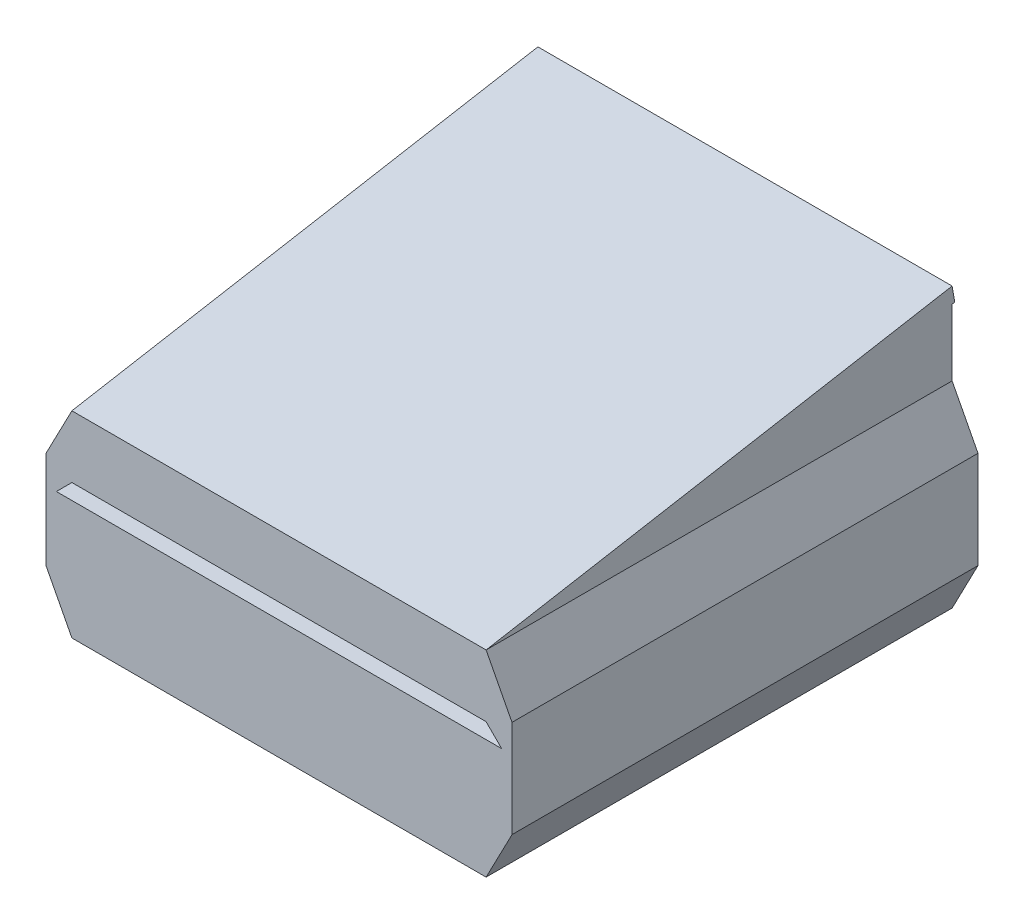
ISO-10303-21;
HEADER;
FILE_DESCRIPTION(('STEP AP214'),'2;1');
FILE_NAME('part.step','',(''),(''),'','','');
FILE_SCHEMA(('AUTOMOTIVE_DESIGN { 1 0 10303 214 1 1 1 1 }'));
ENDSEC;
DATA;
#1=APPLICATION_CONTEXT('core data for automotive mechanical design processes');
#2=APPLICATION_PROTOCOL_DEFINITION('international standard','automotive_design',2000,#1);
#3=PRODUCT_CONTEXT('',#1,'mechanical');
#4=PRODUCT('Part','Part','',(#3));
#5=PRODUCT_RELATED_PRODUCT_CATEGORY('part','',(#4));
#6=PRODUCT_DEFINITION_FORMATION('','',#4);
#7=PRODUCT_DEFINITION_CONTEXT('part definition',#1,'design');
#8=PRODUCT_DEFINITION('design','',#6,#7);
#9=PRODUCT_DEFINITION_SHAPE('','',#8);
#10=(LENGTH_UNIT() NAMED_UNIT(*) SI_UNIT(.MILLI.,.METRE.));
#11=(NAMED_UNIT(*) PLANE_ANGLE_UNIT() SI_UNIT($,.RADIAN.));
#12=(NAMED_UNIT(*) SI_UNIT($,.STERADIAN.) SOLID_ANGLE_UNIT());
#13=UNCERTAINTY_MEASURE_WITH_UNIT(LENGTH_MEASURE(1.E-05),#10,'distance_accuracy_value','');
#14=(GEOMETRIC_REPRESENTATION_CONTEXT(3) GLOBAL_UNCERTAINTY_ASSIGNED_CONTEXT((#13)) GLOBAL_UNIT_ASSIGNED_CONTEXT((#10,
#11,#12)) REPRESENTATION_CONTEXT('',''));
#15=CARTESIAN_POINT('',(0.,0.,0.));
#16=DIRECTION('',(0.,0.,1.));
#17=DIRECTION('',(1.,0.,0.));
#18=AXIS2_PLACEMENT_3D('',#15,#16,#17);
#19=CARTESIAN_POINT('',(80.,38.,-3.00000000000003));
#20=DIRECTION('',(0.,0.,1.));
#21=DIRECTION('',(1.,0.,0.));
#22=AXIS2_PLACEMENT_3D('',#19,#20,#21);
#23=PLANE('',#22);
#24=DIRECTION('',(-1.,0.,0.));
#25=VECTOR('',#24,1.);
#26=CARTESIAN_POINT('',(80.,35.482701106467,-3.00000000000003));
#27=LINE('',#26,#25);
#28=CARTESIAN_POINT('',(77.,35.482701106467,-3.00000000000006));
#29=VERTEX_POINT('',#28);
#30=CARTESIAN_POINT('',(3.,35.482701106467,-3.00000000000006));
#31=VERTEX_POINT('',#30);
#32=EDGE_CURVE('E228',#29,#31,#27,.T.);
#33=ORIENTED_EDGE('',*,*,#32,.F.);
#34=DIRECTION('',(0.,-1.,0.));
#35=VECTOR('',#34,1.);
#36=CARTESIAN_POINT('',(77.,38.,-3.00000000000006));
#37=LINE('',#36,#35);
#38=CARTESIAN_POINT('',(77.,29.,-3.00000000000006));
#39=VERTEX_POINT('',#38);
#40=EDGE_CURVE('E235',#29,#39,#37,.T.);
#41=ORIENTED_EDGE('',*,*,#40,.T.);
#42=DIRECTION('',(0.707106781186549,-0.707106781186546,0.));
#43=VECTOR('',#42,1.);
#44=CARTESIAN_POINT('',(74.,32.,-3.00000000000003));
#45=LINE('',#44,#43);
#46=CARTESIAN_POINT('',(80.,26.,-3.00000000000006));
#47=VERTEX_POINT('',#46);
#48=EDGE_CURVE('E380',#39,#47,#45,.T.);
#49=ORIENTED_EDGE('',*,*,#48,.T.);
#50=DIRECTION('',(-1.,0.,0.));
#51=VECTOR('',#50,1.);
#52=CARTESIAN_POINT('',(80.,26.,-3.00000000000003));
#53=LINE('',#52,#51);
#54=CARTESIAN_POINT('',(0.,26.,-3.00000000000006));
#55=VERTEX_POINT('',#54);
#56=EDGE_CURVE('E243',#47,#55,#53,.T.);
#57=ORIENTED_EDGE('',*,*,#56,.T.);
#58=DIRECTION('',(0.707106781186549,0.707106781186546,0.));
#59=VECTOR('',#58,1.);
#60=CARTESIAN_POINT('',(46.0000000000002,72.,-3.00000000000003));
#61=LINE('',#60,#59);
#62=CARTESIAN_POINT('',(3.,29.,-3.00000000000006));
#63=VERTEX_POINT('',#62);
#64=EDGE_CURVE('E377',#55,#63,#61,.T.);
#65=ORIENTED_EDGE('',*,*,#64,.T.);
#66=DIRECTION('',(0.,-1.,0.));
#67=VECTOR('',#66,1.);
#68=CARTESIAN_POINT('',(3.,38.,-3.00000000000006));
#69=LINE('',#68,#67);
#70=EDGE_CURVE('E241',#31,#63,#69,.T.);
#71=ORIENTED_EDGE('',*,*,#70,.F.);
#72=EDGE_LOOP('',(#33,#41,#49,#57,#65,#71));
#73=FACE_BOUND('',#72,.T.);
#74=ADVANCED_FACE('F33',(#73),#23,.F.);
#75=CARTESIAN_POINT('',(0.,3.,-90.));
#76=DIRECTION('',(0.,0.,1.));
#77=DIRECTION('',(1.,0.,0.));
#78=AXIS2_PLACEMENT_3D('',#75,#76,#77);
#79=PLANE('',#78);
#80=DIRECTION('',(-1.,0.,0.));
#81=VECTOR('',#80,1.);
#82=CARTESIAN_POINT('',(0.,50.8231484281031,-90.));
#83=LINE('',#82,#81);
#84=CARTESIAN_POINT('',(80.,50.8231484281031,-90.));
#85=VERTEX_POINT('',#84);
#86=CARTESIAN_POINT('',(77.,50.8231484281031,-90.));
#87=VERTEX_POINT('',#86);
#88=EDGE_CURVE('E226',#85,#87,#83,.T.);
#89=ORIENTED_EDGE('',*,*,#88,.F.);
#90=DIRECTION('',(0.,-1.,0.));
#91=VECTOR('',#90,1.);
#92=CARTESIAN_POINT('',(80.,68.,-90.));
#93=LINE('',#92,#91);
#94=CARTESIAN_POINT('',(80.,38.,-90.));
#95=VERTEX_POINT('',#94);
#96=EDGE_CURVE('E202',#85,#95,#93,.T.);
#97=ORIENTED_EDGE('',*,*,#96,.T.);
#98=DIRECTION('',(-0.461591586339288,0.887092558542106,0.));
#99=VECTOR('',#98,1.);
#100=CARTESIAN_POINT('',(85.,28.3909366548759,-90.));
#101=LINE('',#100,#99);
#102=CARTESIAN_POINT('',(85.,28.3909366548759,-90.));
#103=VERTEX_POINT('',#102);
#104=EDGE_CURVE('E303',#103,#95,#101,.T.);
#105=ORIENTED_EDGE('',*,*,#104,.F.);
#106=DIRECTION('',(0.,1.,0.));
#107=VECTOR('',#106,1.);
#108=CARTESIAN_POINT('',(85.,9.60906334512409,-90.));
#109=LINE('',#108,#107);
#110=CARTESIAN_POINT('',(85.,9.60906334512409,-90.));
#111=VERTEX_POINT('',#110);
#112=EDGE_CURVE('E299',#111,#103,#109,.T.);
#113=ORIENTED_EDGE('',*,*,#112,.F.);
#114=DIRECTION('',(0.461591586339288,0.887092558542106,0.));
#115=VECTOR('',#114,1.);
#116=CARTESIAN_POINT('',(80.,0.,-90.));
#117=LINE('',#116,#115);
#118=CARTESIAN_POINT('',(80.,0.,-90.));
#119=VERTEX_POINT('',#118);
#120=EDGE_CURVE('E296',#119,#111,#117,.T.);
#121=ORIENTED_EDGE('',*,*,#120,.F.);
#122=DIRECTION('',(-1.,0.,0.));
#123=VECTOR('',#122,1.);
#124=CARTESIAN_POINT('',(0.,0.,-90.));
#125=LINE('',#124,#123);
#126=CARTESIAN_POINT('',(0.,0.,-90.));
#127=VERTEX_POINT('',#126);
#128=EDGE_CURVE('E353',#119,#127,#125,.T.);
#129=ORIENTED_EDGE('',*,*,#128,.T.);
#130=DIRECTION('',(0.461591586339287,-0.887092558542106,0.));
#131=VECTOR('',#130,1.);
#132=CARTESIAN_POINT('',(0.,0.,-90.));
#133=LINE('',#132,#131);
#134=CARTESIAN_POINT('',(-5.,9.60906334512409,-90.));
#135=VERTEX_POINT('',#134);
#136=EDGE_CURVE('E323',#135,#127,#133,.T.);
#137=ORIENTED_EDGE('',*,*,#136,.F.);
#138=DIRECTION('',(0.,-1.,0.));
#139=VECTOR('',#138,1.);
#140=CARTESIAN_POINT('',(-5.,9.60906334512409,-90.));
#141=LINE('',#140,#139);
#142=CARTESIAN_POINT('',(-5.,28.3909366548759,-90.));
#143=VERTEX_POINT('',#142);
#144=EDGE_CURVE('E332',#143,#135,#141,.T.);
#145=ORIENTED_EDGE('',*,*,#144,.F.);
#146=DIRECTION('',(-0.461591586339287,-0.887092558542106,0.));
#147=VECTOR('',#146,1.);
#148=CARTESIAN_POINT('',(-5.,28.3909366548759,-90.));
#149=LINE('',#148,#147);
#150=CARTESIAN_POINT('',(0.,38.,-90.));
#151=VERTEX_POINT('',#150);
#152=EDGE_CURVE('E329',#151,#143,#149,.T.);
#153=ORIENTED_EDGE('',*,*,#152,.F.);
#154=DIRECTION('',(0.,-1.,0.));
#155=VECTOR('',#154,1.);
#156=CARTESIAN_POINT('',(0.,68.,-90.));
#157=LINE('',#156,#155);
#158=CARTESIAN_POINT('',(0.,50.8231484281031,-90.));
#159=VERTEX_POINT('',#158);
#160=EDGE_CURVE('E233',#159,#151,#157,.T.);
#161=ORIENTED_EDGE('',*,*,#160,.F.);
#162=CARTESIAN_POINT('',(3.,50.8231484281031,-90.));
#163=VERTEX_POINT('',#162);
#164=EDGE_CURVE('E56',#163,#159,#83,.T.);
#165=ORIENTED_EDGE('',*,*,#164,.F.);
#166=DIRECTION('',(0.,-1.,0.));
#167=VECTOR('',#166,1.);
#168=CARTESIAN_POINT('',(3.,38.,-90.));
#169=LINE('',#168,#167);
#170=CARTESIAN_POINT('',(3.,29.,-90.));
#171=VERTEX_POINT('',#170);
#172=EDGE_CURVE('E239',#163,#171,#169,.T.);
#173=ORIENTED_EDGE('',*,*,#172,.T.);
#174=DIRECTION('',(-0.707106781186549,-0.707106781186546,0.));
#175=VECTOR('',#174,1.);
#176=CARTESIAN_POINT('',(3.,29.,-90.));
#177=LINE('',#176,#175);
#178=CARTESIAN_POINT('',(0.,26.,-90.));
#179=VERTEX_POINT('',#178);
#180=EDGE_CURVE('E372',#171,#179,#177,.T.);
#181=ORIENTED_EDGE('',*,*,#180,.T.);
#182=DIRECTION('',(-0.707106781186548,-0.707106781186547,0.));
#183=VECTOR('',#182,1.);
#184=CARTESIAN_POINT('',(-3.,23.,-90.));
#185=LINE('',#184,#183);
#186=CARTESIAN_POINT('',(-3.,23.,-90.));
#187=VERTEX_POINT('',#186);
#188=EDGE_CURVE('E261',#179,#187,#185,.T.);
#189=ORIENTED_EDGE('',*,*,#188,.T.);
#190=DIRECTION('',(1.,0.,0.));
#191=VECTOR('',#190,1.);
#192=CARTESIAN_POINT('',(0.,23.,-90.));
#193=LINE('',#192,#191);
#194=CARTESIAN_POINT('',(0.,23.,-90.));
#195=VERTEX_POINT('',#194);
#196=EDGE_CURVE('E258',#187,#195,#193,.T.);
#197=ORIENTED_EDGE('',*,*,#196,.T.);
#198=DIRECTION('',(0.,1.,0.));
#199=VECTOR('',#198,1.);
#200=CARTESIAN_POINT('',(0.,38.,-90.));
#201=LINE('',#200,#199);
#202=CARTESIAN_POINT('',(0.,3.,-90.));
#203=VERTEX_POINT('',#202);
#204=EDGE_CURVE('E325',#203,#195,#201,.T.);
#205=ORIENTED_EDGE('',*,*,#204,.F.);
#206=DIRECTION('',(-1.,0.,0.));
#207=VECTOR('',#206,1.);
#208=CARTESIAN_POINT('',(0.,3.,-90.));
#209=LINE('',#208,#207);
#210=CARTESIAN_POINT('',(80.,3.,-90.));
#211=VERTEX_POINT('',#210);
#212=EDGE_CURVE('E355',#211,#203,#209,.T.);
#213=ORIENTED_EDGE('',*,*,#212,.F.);
#214=DIRECTION('',(0.,-1.,0.));
#215=VECTOR('',#214,1.);
#216=CARTESIAN_POINT('',(80.,38.,-90.));
#217=LINE('',#216,#215);
#218=CARTESIAN_POINT('',(80.,23.,-90.));
#219=VERTEX_POINT('',#218);
#220=EDGE_CURVE('E306',#219,#211,#217,.T.);
#221=ORIENTED_EDGE('',*,*,#220,.F.);
#222=DIRECTION('',(1.,0.,0.));
#223=VECTOR('',#222,1.);
#224=CARTESIAN_POINT('',(80.,23.,-90.));
#225=LINE('',#224,#223);
#226=CARTESIAN_POINT('',(83.,23.,-90.));
#227=VERTEX_POINT('',#226);
#228=EDGE_CURVE('E279',#219,#227,#225,.T.);
#229=ORIENTED_EDGE('',*,*,#228,.T.);
#230=DIRECTION('',(-0.707106781186548,0.707106781186547,0.));
#231=VECTOR('',#230,1.);
#232=CARTESIAN_POINT('',(83.,23.,-90.));
#233=LINE('',#232,#231);
#234=CARTESIAN_POINT('',(80.,26.,-90.));
#235=VERTEX_POINT('',#234);
#236=EDGE_CURVE('E282',#227,#235,#233,.T.);
#237=ORIENTED_EDGE('',*,*,#236,.T.);
#238=DIRECTION('',(-0.707106781186549,0.707106781186546,0.));
#239=VECTOR('',#238,1.);
#240=CARTESIAN_POINT('',(77.,29.,-90.));
#241=LINE('',#240,#239);
#242=CARTESIAN_POINT('',(77.,29.,-90.));
#243=VERTEX_POINT('',#242);
#244=EDGE_CURVE('E369',#235,#243,#241,.T.);
#245=ORIENTED_EDGE('',*,*,#244,.T.);
#246=DIRECTION('',(0.,-1.,0.));
#247=VECTOR('',#246,1.);
#248=CARTESIAN_POINT('',(77.,38.,-90.));
#249=LINE('',#248,#247);
#250=EDGE_CURVE('E237',#87,#243,#249,.T.);
#251=ORIENTED_EDGE('',*,*,#250,.F.);
#252=EDGE_LOOP('',(#89,#97,#105,#113,#121,#129,#137,#145,#153,#161,#165,#173,#181,#189,#197,
#205,#213,#221,#229,#237,#245,#251));
#253=FACE_BOUND('',#252,.T.);
#254=ADVANCED_FACE('F413',(#253),#79,.F.);
#255=CARTESIAN_POINT('',(3.,38.,-3.00000000000006));
#256=DIRECTION('',(-1.,0.,0.));
#257=DIRECTION('',(0.,0.,1.));
#258=AXIS2_PLACEMENT_3D('',#255,#256,#257);
#259=PLANE('',#258);
#260=DIRECTION('',(0.,0.173648177666927,-0.984807753012209));
#261=VECTOR('',#260,1.);
#262=CARTESIAN_POINT('',(3.,35.5586069559507,-3.43048346417991));
#263=LINE('',#262,#261);
#264=EDGE_CURVE('E48',#31,#163,#263,.T.);
#265=ORIENTED_EDGE('',*,*,#264,.F.);
#266=ORIENTED_EDGE('',*,*,#70,.T.);
#267=DIRECTION('',(0.,0.,-1.));
#268=VECTOR('',#267,1.);
#269=CARTESIAN_POINT('',(3.,29.,-90.));
#270=LINE('',#269,#268);
#271=EDGE_CURVE('E358',#63,#171,#270,.T.);
#272=ORIENTED_EDGE('',*,*,#271,.T.);
#273=ORIENTED_EDGE('',*,*,#172,.F.);
#274=EDGE_LOOP('',(#265,#266,#272,#273));
#275=FACE_BOUND('',#274,.T.);
#276=ADVANCED_FACE('F452',(#275),#259,.F.);
#277=CARTESIAN_POINT('',(77.,38.,-3.00000000000006));
#278=DIRECTION('',(1.,0.,0.));
#279=DIRECTION('',(0.,0.,-1.));
#280=AXIS2_PLACEMENT_3D('',#277,#278,#279);
#281=PLANE('',#280);
#282=DIRECTION('',(0.,-0.173648177666927,0.984807753012209));
#283=VECTOR('',#282,1.);
#284=CARTESIAN_POINT('',(77.,35.5586069559507,-3.43048346417991));
#285=LINE('',#284,#283);
#286=EDGE_CURVE('E222',#87,#29,#285,.T.);
#287=ORIENTED_EDGE('',*,*,#286,.F.);
#288=ORIENTED_EDGE('',*,*,#250,.T.);
#289=DIRECTION('',(0.,0.,1.));
#290=VECTOR('',#289,1.);
#291=CARTESIAN_POINT('',(77.,29.,-3.00000000000006));
#292=LINE('',#291,#290);
#293=EDGE_CURVE('E374',#243,#39,#292,.T.);
#294=ORIENTED_EDGE('',*,*,#293,.T.);
#295=ORIENTED_EDGE('',*,*,#40,.F.);
#296=EDGE_LOOP('',(#287,#288,#294,#295));
#297=FACE_BOUND('',#296,.T.);
#298=ADVANCED_FACE('F427',(#297),#281,.F.);
#299=CARTESIAN_POINT('',(0.,38.,-90.));
#300=DIRECTION('',(1.,0.,0.));
#301=DIRECTION('',(0.,1.,0.));
#302=AXIS2_PLACEMENT_3D('',#299,#300,#301);
#303=PLANE('',#302);
#304=DIRECTION('',(0.,0.,1.));
#305=VECTOR('',#304,1.);
#306=CARTESIAN_POINT('',(0.,23.,-90.));
#307=LINE('',#306,#305);
#308=CARTESIAN_POINT('',(0.,23.,-3.00000000000003));
#309=VERTEX_POINT('',#308);
#310=EDGE_CURVE('E265',#195,#309,#307,.T.);
#311=ORIENTED_EDGE('',*,*,#310,.T.);
#312=DIRECTION('',(0.,-1.,0.));
#313=VECTOR('',#312,1.);
#314=CARTESIAN_POINT('',(0.,23.,-3.));
#315=LINE('',#314,#313);
#316=CARTESIAN_POINT('',(0.,3.,-3.));
#317=VERTEX_POINT('',#316);
#318=EDGE_CURVE('E248',#309,#317,#315,.T.);
#319=ORIENTED_EDGE('',*,*,#318,.T.);
#320=DIRECTION('',(0.,0.,1.));
#321=VECTOR('',#320,1.);
#322=CARTESIAN_POINT('',(0.,3.,0.));
#323=LINE('',#322,#321);
#324=EDGE_CURVE('E349',#203,#317,#323,.T.);
#325=ORIENTED_EDGE('',*,*,#324,.F.);
#326=ORIENTED_EDGE('',*,*,#204,.T.);
#327=EDGE_LOOP('',(#311,#319,#325,#326));
#328=FACE_BOUND('',#327,.T.);
#329=ADVANCED_FACE('F458',(#328),#303,.T.);
#330=CARTESIAN_POINT('',(0.,3.,0.));
#331=DIRECTION('',(0.,-1.,0.));
#332=DIRECTION('',(0.,0.,-1.));
#333=AXIS2_PLACEMENT_3D('',#330,#331,#332);
#334=PLANE('',#333);
#335=DIRECTION('',(1.,0.,0.));
#336=VECTOR('',#335,1.);
#337=CARTESIAN_POINT('',(0.,3.,-3.));
#338=LINE('',#337,#336);
#339=CARTESIAN_POINT('',(80.,3.,-3.));
#340=VERTEX_POINT('',#339);
#341=EDGE_CURVE('E250',#317,#340,#338,.T.);
#342=ORIENTED_EDGE('',*,*,#341,.T.);
#343=DIRECTION('',(0.,0.,-1.));
#344=VECTOR('',#343,1.);
#345=CARTESIAN_POINT('',(80.,3.,0.));
#346=LINE('',#345,#344);
#347=EDGE_CURVE('E352',#340,#211,#346,.T.);
#348=ORIENTED_EDGE('',*,*,#347,.T.);
#349=ORIENTED_EDGE('',*,*,#212,.T.);
#350=ORIENTED_EDGE('',*,*,#324,.T.);
#351=EDGE_LOOP('',(#342,#348,#349,#350));
#352=FACE_BOUND('',#351,.T.);
#353=ADVANCED_FACE('F462',(#352),#334,.F.);
#354=CARTESIAN_POINT('',(80.,38.,-90.));
#355=DIRECTION('',(-1.,0.,0.));
#356=DIRECTION('',(0.,-1.,0.));
#357=AXIS2_PLACEMENT_3D('',#354,#355,#356);
#358=PLANE('',#357);
#359=ORIENTED_EDGE('',*,*,#347,.F.);
#360=DIRECTION('',(0.,1.,0.));
#361=VECTOR('',#360,1.);
#362=CARTESIAN_POINT('',(80.,23.,-3.));
#363=LINE('',#362,#361);
#364=CARTESIAN_POINT('',(80.,23.,-3.00000000000003));
#365=VERTEX_POINT('',#364);
#366=EDGE_CURVE('E252',#340,#365,#363,.T.);
#367=ORIENTED_EDGE('',*,*,#366,.T.);
#368=DIRECTION('',(0.,0.,1.));
#369=VECTOR('',#368,1.);
#370=CARTESIAN_POINT('',(80.,23.,-90.));
#371=LINE('',#370,#369);
#372=EDGE_CURVE('E285',#219,#365,#371,.T.);
#373=ORIENTED_EDGE('',*,*,#372,.F.);
#374=ORIENTED_EDGE('',*,*,#220,.T.);
#375=EDGE_LOOP('',(#359,#367,#373,#374));
#376=FACE_BOUND('',#375,.T.);
#377=ADVANCED_FACE('F470',(#376),#358,.T.);
#378=CARTESIAN_POINT('',(0.,3.,0.));
#379=DIRECTION('',(0.,0.,-1.));
#380=DIRECTION('',(-1.,0.,0.));
#381=AXIS2_PLACEMENT_3D('',#378,#379,#380);
#382=PLANE('',#381);
#383=DIRECTION('',(1.,0.,0.));
#384=VECTOR('',#383,1.);
#385=CARTESIAN_POINT('',(80.,26.,0.));
#386=LINE('',#385,#384);
#387=CARTESIAN_POINT('',(0.,26.,0.));
#388=VERTEX_POINT('',#387);
#389=CARTESIAN_POINT('',(80.,26.,0.));
#390=VERTEX_POINT('',#389);
#391=EDGE_CURVE('E245',#388,#390,#386,.T.);
#392=ORIENTED_EDGE('',*,*,#391,.T.);
#393=DIRECTION('',(-0.707106781186548,0.707106781186547,0.));
#394=VECTOR('',#393,1.);
#395=CARTESIAN_POINT('',(83.,23.,0.));
#396=LINE('',#395,#394);
#397=CARTESIAN_POINT('',(83.,23.,0.));
#398=VERTEX_POINT('',#397);
#399=EDGE_CURVE('E257',#398,#390,#396,.T.);
#400=ORIENTED_EDGE('',*,*,#399,.F.);
#401=DIRECTION('',(1.,0.,0.));
#402=VECTOR('',#401,1.);
#403=CARTESIAN_POINT('',(0.,23.,0.));
#404=LINE('',#403,#402);
#405=CARTESIAN_POINT('',(-3.,23.,0.));
#406=VERTEX_POINT('',#405);
#407=EDGE_CURVE('E266',#406,#398,#404,.T.);
#408=ORIENTED_EDGE('',*,*,#407,.F.);
#409=DIRECTION('',(-0.707106781186548,-0.707106781186547,0.));
#410=VECTOR('',#409,1.);
#411=CARTESIAN_POINT('',(-3.,23.,0.));
#412=LINE('',#411,#410);
#413=EDGE_CURVE('E262',#388,#406,#412,.T.);
#414=ORIENTED_EDGE('',*,*,#413,.F.);
#415=EDGE_LOOP('',(#392,#400,#408,#414));
#416=FACE_BOUND('',#415,.T.);
#417=DIRECTION('',(-0.461591586339288,0.887092558542106,0.));
#418=VECTOR('',#417,1.);
#419=CARTESIAN_POINT('',(85.,28.3909366548759,0.));
#420=LINE('',#419,#418);
#421=CARTESIAN_POINT('',(85.,28.3909366548759,0.));
#422=VERTEX_POINT('',#421);
#423=CARTESIAN_POINT('',(80.,38.,0.));
#424=VERTEX_POINT('',#423);
#425=EDGE_CURVE('E300',#422,#424,#420,.T.);
#426=ORIENTED_EDGE('',*,*,#425,.T.);
#427=DIRECTION('',(-1.,0.,0.));
#428=VECTOR('',#427,1.);
#429=CARTESIAN_POINT('',(0.,37.9999999999988,0.));
#430=LINE('',#429,#428);
#431=CARTESIAN_POINT('',(0.,38.,0.));
#432=VERTEX_POINT('',#431);
#433=EDGE_CURVE('E41',#424,#432,#430,.T.);
#434=ORIENTED_EDGE('',*,*,#433,.T.);
#435=DIRECTION('',(-0.461591586339287,-0.887092558542106,0.));
#436=VECTOR('',#435,1.);
#437=CARTESIAN_POINT('',(-5.,28.3909366548759,0.));
#438=LINE('',#437,#436);
#439=CARTESIAN_POINT('',(-5.,28.3909366548759,0.));
#440=VERTEX_POINT('',#439);
#441=EDGE_CURVE('E338',#432,#440,#438,.T.);
#442=ORIENTED_EDGE('',*,*,#441,.T.);
#443=DIRECTION('',(0.,-1.,0.));
#444=VECTOR('',#443,1.);
#445=CARTESIAN_POINT('',(-5.,9.60906334512409,0.));
#446=LINE('',#445,#444);
#447=CARTESIAN_POINT('',(-5.,9.60906334512409,0.));
#448=VERTEX_POINT('',#447);
#449=EDGE_CURVE('E326',#440,#448,#446,.T.);
#450=ORIENTED_EDGE('',*,*,#449,.T.);
#451=DIRECTION('',(0.461591586339287,-0.887092558542106,0.));
#452=VECTOR('',#451,1.);
#453=CARTESIAN_POINT('',(0.,0.,0.));
#454=LINE('',#453,#452);
#455=CARTESIAN_POINT('',(0.,0.,0.));
#456=VERTEX_POINT('',#455);
#457=EDGE_CURVE('E319',#448,#456,#454,.T.);
#458=ORIENTED_EDGE('',*,*,#457,.T.);
#459=DIRECTION('',(1.,0.,0.));
#460=VECTOR('',#459,1.);
#461=CARTESIAN_POINT('',(0.,0.,0.));
#462=LINE('',#461,#460);
#463=CARTESIAN_POINT('',(80.,0.,0.));
#464=VERTEX_POINT('',#463);
#465=EDGE_CURVE('E360',#456,#464,#462,.T.);
#466=ORIENTED_EDGE('',*,*,#465,.T.);
#467=DIRECTION('',(0.461591586339288,0.887092558542106,0.));
#468=VECTOR('',#467,1.);
#469=CARTESIAN_POINT('',(80.,0.,0.));
#470=LINE('',#469,#468);
#471=CARTESIAN_POINT('',(85.,9.60906334512409,0.));
#472=VERTEX_POINT('',#471);
#473=EDGE_CURVE('E273',#464,#472,#470,.T.);
#474=ORIENTED_EDGE('',*,*,#473,.T.);
#475=DIRECTION('',(0.,1.,0.));
#476=VECTOR('',#475,1.);
#477=CARTESIAN_POINT('',(85.,9.60906334512409,0.));
#478=LINE('',#477,#476);
#479=EDGE_CURVE('E312',#472,#422,#478,.T.);
#480=ORIENTED_EDGE('',*,*,#479,.T.);
#481=EDGE_LOOP('',(#426,#434,#442,#450,#458,#466,#474,#480));
#482=FACE_BOUND('',#481,.T.);
#483=ADVANCED_FACE('F389',(#416,#482),#382,.F.);
#484=CARTESIAN_POINT('',(0.,0.,0.));
#485=DIRECTION('',(0.,-1.,0.));
#486=DIRECTION('',(0.,0.,-1.));
#487=AXIS2_PLACEMENT_3D('',#484,#485,#486);
#488=PLANE('',#487);
#489=DIRECTION('',(0.,0.,1.));
#490=VECTOR('',#489,1.);
#491=CARTESIAN_POINT('',(0.,0.,0.));
#492=LINE('',#491,#490);
#493=EDGE_CURVE('E345',#127,#456,#492,.T.);
#494=ORIENTED_EDGE('',*,*,#493,.F.);
#495=ORIENTED_EDGE('',*,*,#128,.F.);
#496=DIRECTION('',(0.,0.,-1.));
#497=VECTOR('',#496,1.);
#498=CARTESIAN_POINT('',(80.,0.,0.));
#499=LINE('',#498,#497);
#500=EDGE_CURVE('E363',#464,#119,#499,.T.);
#501=ORIENTED_EDGE('',*,*,#500,.F.);
#502=ORIENTED_EDGE('',*,*,#465,.F.);
#503=EDGE_LOOP('',(#494,#495,#501,#502));
#504=FACE_BOUND('',#503,.T.);
#505=ADVANCED_FACE('F407',(#504),#488,.T.);
#506=CARTESIAN_POINT('',(0.,0.,-90.));
#507=DIRECTION('',(-0.887092558542106,-0.461591586339287,0.));
#508=DIRECTION('',(0.461591586339287,-0.887092558542106,0.));
#509=AXIS2_PLACEMENT_3D('',#506,#507,#508);
#510=PLANE('',#509);
#511=ORIENTED_EDGE('',*,*,#457,.F.);
#512=DIRECTION('',(0.,0.,1.));
#513=VECTOR('',#512,1.);
#514=CARTESIAN_POINT('',(-5.,9.60906334512409,-90.));
#515=LINE('',#514,#513);
#516=EDGE_CURVE('E343',#135,#448,#515,.T.);
#517=ORIENTED_EDGE('',*,*,#516,.F.);
#518=ORIENTED_EDGE('',*,*,#136,.T.);
#519=ORIENTED_EDGE('',*,*,#493,.T.);
#520=EDGE_LOOP('',(#511,#517,#518,#519));
#521=FACE_BOUND('',#520,.T.);
#522=ADVANCED_FACE('F481',(#521),#510,.T.);
#523=CARTESIAN_POINT('',(-5.,9.60906334512409,-90.));
#524=DIRECTION('',(-1.,0.,0.));
#525=DIRECTION('',(0.,-1.,0.));
#526=AXIS2_PLACEMENT_3D('',#523,#524,#525);
#527=PLANE('',#526);
#528=ORIENTED_EDGE('',*,*,#449,.F.);
#529=DIRECTION('',(0.,0.,1.));
#530=VECTOR('',#529,1.);
#531=CARTESIAN_POINT('',(-5.,28.3909366548759,-90.));
#532=LINE('',#531,#530);
#533=EDGE_CURVE('E346',#143,#440,#532,.T.);
#534=ORIENTED_EDGE('',*,*,#533,.F.);
#535=ORIENTED_EDGE('',*,*,#144,.T.);
#536=ORIENTED_EDGE('',*,*,#516,.T.);
#537=EDGE_LOOP('',(#528,#534,#535,#536));
#538=FACE_BOUND('',#537,.T.);
#539=ADVANCED_FACE('F400',(#538),#527,.T.);
#540=CARTESIAN_POINT('',(-5.,28.3909366548759,-90.));
#541=DIRECTION('',(-0.887092558542106,0.461591586339287,0.));
#542=DIRECTION('',(-0.461591586339287,-0.887092558542106,0.));
#543=AXIS2_PLACEMENT_3D('',#540,#541,#542);
#544=PLANE('',#543);
#545=ORIENTED_EDGE('',*,*,#441,.F.);
#546=DIRECTION('',(0.,0.,1.));
#547=VECTOR('',#546,1.);
#548=CARTESIAN_POINT('',(0.,38.,-90.));
#549=LINE('',#548,#547);
#550=EDGE_CURVE('E335',#151,#432,#549,.T.);
#551=ORIENTED_EDGE('',*,*,#550,.F.);
#552=ORIENTED_EDGE('',*,*,#152,.T.);
#553=ORIENTED_EDGE('',*,*,#533,.T.);
#554=EDGE_LOOP('',(#545,#551,#552,#553));
#555=FACE_BOUND('',#554,.T.);
#556=ADVANCED_FACE('F396',(#555),#544,.T.);
#557=CARTESIAN_POINT('',(80.,0.,-90.));
#558=DIRECTION('',(0.887092558542106,-0.461591586339288,0.));
#559=DIRECTION('',(0.461591586339288,0.887092558542106,0.));
#560=AXIS2_PLACEMENT_3D('',#557,#558,#559);
#561=PLANE('',#560);
#562=ORIENTED_EDGE('',*,*,#473,.F.);
#563=ORIENTED_EDGE('',*,*,#500,.T.);
#564=ORIENTED_EDGE('',*,*,#120,.T.);
#565=DIRECTION('',(0.,0.,1.));
#566=VECTOR('',#565,1.);
#567=CARTESIAN_POINT('',(85.,9.60906334512409,-90.));
#568=LINE('',#567,#566);
#569=EDGE_CURVE('E309',#111,#472,#568,.T.);
#570=ORIENTED_EDGE('',*,*,#569,.T.);
#571=EDGE_LOOP('',(#562,#563,#564,#570));
#572=FACE_BOUND('',#571,.T.);
#573=ADVANCED_FACE('F411',(#572),#561,.T.);
#574=CARTESIAN_POINT('',(85.,28.3909366548759,-90.));
#575=DIRECTION('',(0.887092558542106,0.461591586339288,0.));
#576=DIRECTION('',(-0.461591586339288,0.887092558542106,0.));
#577=AXIS2_PLACEMENT_3D('',#574,#575,#576);
#578=PLANE('',#577);
#579=ORIENTED_EDGE('',*,*,#425,.F.);
#580=DIRECTION('',(0.,0.,1.));
#581=VECTOR('',#580,1.);
#582=CARTESIAN_POINT('',(85.,28.3909366548759,-90.));
#583=LINE('',#582,#581);
#584=EDGE_CURVE('E320',#103,#422,#583,.T.);
#585=ORIENTED_EDGE('',*,*,#584,.F.);
#586=ORIENTED_EDGE('',*,*,#104,.T.);
#587=DIRECTION('',(0.,0.,1.));
#588=VECTOR('',#587,1.);
#589=CARTESIAN_POINT('',(80.,38.,-90.));
#590=LINE('',#589,#588);
#591=EDGE_CURVE('E317',#95,#424,#590,.T.);
#592=ORIENTED_EDGE('',*,*,#591,.T.);
#593=EDGE_LOOP('',(#579,#585,#586,#592));
#594=FACE_BOUND('',#593,.T.);
#595=ADVANCED_FACE('F420',(#594),#578,.T.);
#596=CARTESIAN_POINT('',(85.,9.60906334512409,-90.));
#597=DIRECTION('',(1.,0.,0.));
#598=DIRECTION('',(0.,1.,0.));
#599=AXIS2_PLACEMENT_3D('',#596,#597,#598);
#600=PLANE('',#599);
#601=ORIENTED_EDGE('',*,*,#479,.F.);
#602=ORIENTED_EDGE('',*,*,#569,.F.);
#603=ORIENTED_EDGE('',*,*,#112,.T.);
#604=ORIENTED_EDGE('',*,*,#584,.T.);
#605=EDGE_LOOP('',(#601,#602,#603,#604));
#606=FACE_BOUND('',#605,.T.);
#607=ADVANCED_FACE('F418',(#606),#600,.T.);
#608=CARTESIAN_POINT('',(83.,23.,-90.));
#609=DIRECTION('',(0.707106781186547,0.707106781186548,0.));
#610=DIRECTION('',(-0.707106781186548,0.707106781186547,0.));
#611=AXIS2_PLACEMENT_3D('',#608,#609,#610);
#612=PLANE('',#611);
#613=ORIENTED_EDGE('',*,*,#399,.T.);
#614=DIRECTION('',(0.,0.,1.));
#615=VECTOR('',#614,1.);
#616=CARTESIAN_POINT('',(80.,26.,-90.));
#617=LINE('',#616,#615);
#618=EDGE_CURVE('E290',#47,#390,#617,.T.);
#619=ORIENTED_EDGE('',*,*,#618,.F.);
#620=EDGE_CURVE('E268',#235,#47,#617,.T.);
#621=ORIENTED_EDGE('',*,*,#620,.F.);
#622=ORIENTED_EDGE('',*,*,#236,.F.);
#623=DIRECTION('',(0.,0.,1.));
#624=VECTOR('',#623,1.);
#625=CARTESIAN_POINT('',(83.,23.,-90.));
#626=LINE('',#625,#624);
#627=EDGE_CURVE('E291',#227,#398,#626,.T.);
#628=ORIENTED_EDGE('',*,*,#627,.T.);
#629=EDGE_LOOP('',(#613,#619,#621,#622,#628));
#630=FACE_BOUND('',#629,.T.);
#631=ADVANCED_FACE('F436',(#630),#612,.F.);
#632=CARTESIAN_POINT('',(0.,23.,-90.));
#633=DIRECTION('',(0.,-1.,0.));
#634=DIRECTION('',(0.,0.,-1.));
#635=AXIS2_PLACEMENT_3D('',#632,#633,#634);
#636=PLANE('',#635);
#637=ORIENTED_EDGE('',*,*,#407,.T.);
#638=ORIENTED_EDGE('',*,*,#627,.F.);
#639=ORIENTED_EDGE('',*,*,#228,.F.);
#640=ORIENTED_EDGE('',*,*,#372,.T.);
#641=DIRECTION('',(-1.,0.,0.));
#642=VECTOR('',#641,1.);
#643=CARTESIAN_POINT('',(0.,23.,-3.));
#644=LINE('',#643,#642);
#645=EDGE_CURVE('E254',#365,#309,#644,.T.);
#646=ORIENTED_EDGE('',*,*,#645,.T.);
#647=ORIENTED_EDGE('',*,*,#310,.F.);
#648=ORIENTED_EDGE('',*,*,#196,.F.);
#649=DIRECTION('',(0.,0.,1.));
#650=VECTOR('',#649,1.);
#651=CARTESIAN_POINT('',(-3.,23.,-90.));
#652=LINE('',#651,#650);
#653=EDGE_CURVE('E271',#187,#406,#652,.T.);
#654=ORIENTED_EDGE('',*,*,#653,.T.);
#655=EDGE_LOOP('',(#637,#638,#639,#640,#646,#647,#648,#654));
#656=FACE_BOUND('',#655,.T.);
#657=ADVANCED_FACE('F472',(#656),#636,.F.);
#658=CARTESIAN_POINT('',(-3.,23.,-90.));
#659=DIRECTION('',(-0.707106781186547,0.707106781186548,0.));
#660=DIRECTION('',(-0.707106781186548,-0.707106781186547,0.));
#661=AXIS2_PLACEMENT_3D('',#658,#659,#660);
#662=PLANE('',#661);
#663=ORIENTED_EDGE('',*,*,#413,.T.);
#664=ORIENTED_EDGE('',*,*,#653,.F.);
#665=ORIENTED_EDGE('',*,*,#188,.F.);
#666=DIRECTION('',(0.,0.,1.));
#667=VECTOR('',#666,1.);
#668=CARTESIAN_POINT('',(0.,26.,-90.));
#669=LINE('',#668,#667);
#670=EDGE_CURVE('E274',#179,#55,#669,.T.);
#671=ORIENTED_EDGE('',*,*,#670,.T.);
#672=EDGE_CURVE('E277',#55,#388,#669,.T.);
#673=ORIENTED_EDGE('',*,*,#672,.T.);
#674=EDGE_LOOP('',(#663,#664,#665,#671,#673));
#675=FACE_BOUND('',#674,.T.);
#676=ADVANCED_FACE('F447',(#675),#662,.F.);
#677=CARTESIAN_POINT('',(0.,0.,-3.));
#678=DIRECTION('',(0.,0.,1.));
#679=DIRECTION('',(1.,0.,0.));
#680=AXIS2_PLACEMENT_3D('',#677,#678,#679);
#681=PLANE('',#680);
#682=ORIENTED_EDGE('',*,*,#318,.F.);
#683=ORIENTED_EDGE('',*,*,#645,.F.);
#684=ORIENTED_EDGE('',*,*,#366,.F.);
#685=ORIENTED_EDGE('',*,*,#341,.F.);
#686=EDGE_LOOP('',(#682,#683,#684,#685));
#687=FACE_BOUND('',#686,.T.);
#688=ADVANCED_FACE('F466',(#687),#681,.F.);
#689=CARTESIAN_POINT('',(0.,26.,0.));
#690=DIRECTION('',(0.,-1.,0.));
#691=DIRECTION('',(0.,0.,-1.));
#692=AXIS2_PLACEMENT_3D('',#689,#690,#691);
#693=PLANE('',#692);
#694=ORIENTED_EDGE('',*,*,#672,.F.);
#695=ORIENTED_EDGE('',*,*,#56,.F.);
#696=ORIENTED_EDGE('',*,*,#618,.T.);
#697=ORIENTED_EDGE('',*,*,#391,.F.);
#698=EDGE_LOOP('',(#694,#695,#696,#697));
#699=FACE_BOUND('',#698,.T.);
#700=ADVANCED_FACE('F441',(#699),#693,.T.);
#701=CARTESIAN_POINT('',(3.,29.,-3.00000000000006));
#702=DIRECTION('',(0.707106781186546,-0.707106781186549,0.));
#703=DIRECTION('',(0.,0.,1.));
#704=AXIS2_PLACEMENT_3D('',#701,#702,#703);
#705=PLANE('',#704);
#706=ORIENTED_EDGE('',*,*,#64,.F.);
#707=ORIENTED_EDGE('',*,*,#670,.F.);
#708=ORIENTED_EDGE('',*,*,#180,.F.);
#709=ORIENTED_EDGE('',*,*,#271,.F.);
#710=EDGE_LOOP('',(#706,#707,#708,#709));
#711=FACE_BOUND('',#710,.T.);
#712=ADVANCED_FACE('F451',(#711),#705,.T.);
#713=CARTESIAN_POINT('',(77.,29.,-3.00000000000006));
#714=DIRECTION('',(-0.707106781186546,-0.707106781186549,0.));
#715=DIRECTION('',(0.,0.,-1.));
#716=AXIS2_PLACEMENT_3D('',#713,#714,#715);
#717=PLANE('',#716);
#718=ORIENTED_EDGE('',*,*,#244,.F.);
#719=ORIENTED_EDGE('',*,*,#620,.T.);
#720=ORIENTED_EDGE('',*,*,#48,.F.);
#721=ORIENTED_EDGE('',*,*,#293,.F.);
#722=EDGE_LOOP('',(#718,#719,#720,#721));
#723=FACE_BOUND('',#722,.T.);
#724=ADVANCED_FACE('F432',(#723),#717,.T.);
#725=CARTESIAN_POINT('',(0.,68.,0.));
#726=DIRECTION('',(1.,0.,0.));
#727=DIRECTION('',(0.,0.,-1.));
#728=AXIS2_PLACEMENT_3D('',#725,#726,#727);
#729=PLANE('',#728);
#730=DIRECTION('',(0.,-0.173648177666927,0.984807753012209));
#731=VECTOR('',#730,1.);
#732=CARTESIAN_POINT('',(0.,68.,-170.138454588541));
#733=LINE('',#732,#731);
#734=CARTESIAN_POINT('',(0.,53.8694282637604,-90.));
#735=VERTEX_POINT('',#734);
#736=EDGE_CURVE('E11',#432,#735,#733,.F.);
#737=ORIENTED_EDGE('',*,*,#736,.T.);
#738=DIRECTION('',(0.,0.984807753012209,0.173648177666927));
#739=VECTOR('',#738,1.);
#740=CARTESIAN_POINT('',(0.,50.9150050047237,-90.5209445330008));
#741=LINE('',#740,#739);
#742=CARTESIAN_POINT('',(0.,50.9150050047237,-90.5209445330008));
#743=VERTEX_POINT('',#742);
#744=EDGE_CURVE('E213',#743,#735,#741,.T.);
#745=ORIENTED_EDGE('',*,*,#744,.F.);
#746=DIRECTION('',(0.,-0.173648177666927,0.984807753012209));
#747=VECTOR('',#746,1.);
#748=CARTESIAN_POINT('',(0.,35.0455767409622,-0.520944533000984));
#749=LINE('',#748,#747);
#750=EDGE_CURVE('E214',#743,#159,#749,.T.);
#751=ORIENTED_EDGE('',*,*,#750,.T.);
#752=ORIENTED_EDGE('',*,*,#160,.T.);
#753=ORIENTED_EDGE('',*,*,#550,.T.);
#754=EDGE_LOOP('',(#737,#745,#751,#752,#753));
#755=FACE_BOUND('',#754,.T.);
#756=ADVANCED_FACE('F422',(#755),#729,.F.);
#757=CARTESIAN_POINT('',(80.,68.,-90.));
#758=DIRECTION('',(-1.,0.,0.));
#759=DIRECTION('',(0.,0.,1.));
#760=AXIS2_PLACEMENT_3D('',#757,#758,#759);
#761=PLANE('',#760);
#762=DIRECTION('',(0.,0.173648177666927,-0.984807753012209));
#763=VECTOR('',#762,1.);
#764=CARTESIAN_POINT('',(80.,68.,-170.138454588541));
#765=LINE('',#764,#763);
#766=CARTESIAN_POINT('',(80.,53.8694282637604,-90.));
#767=VERTEX_POINT('',#766);
#768=EDGE_CURVE('E384',#767,#424,#765,.F.);
#769=ORIENTED_EDGE('',*,*,#768,.T.);
#770=ORIENTED_EDGE('',*,*,#591,.F.);
#771=ORIENTED_EDGE('',*,*,#96,.F.);
#772=DIRECTION('',(0.,0.173648177666927,-0.984807753012209));
#773=VECTOR('',#772,1.);
#774=CARTESIAN_POINT('',(80.,35.0455767409622,-0.520944533000984));
#775=LINE('',#774,#773);
#776=CARTESIAN_POINT('',(80.,50.9150050047237,-90.5209445330008));
#777=VERTEX_POINT('',#776);
#778=EDGE_CURVE('E195',#85,#777,#775,.T.);
#779=ORIENTED_EDGE('',*,*,#778,.T.);
#780=DIRECTION('',(0.,0.984807753012209,0.173648177666927));
#781=VECTOR('',#780,1.);
#782=CARTESIAN_POINT('',(80.,50.9150050047237,-90.5209445330008));
#783=LINE('',#782,#781);
#784=EDGE_CURVE('E199',#777,#767,#783,.T.);
#785=ORIENTED_EDGE('',*,*,#784,.T.);
#786=EDGE_LOOP('',(#769,#770,#771,#779,#785));
#787=FACE_BOUND('',#786,.T.);
#788=ADVANCED_FACE('F198',(#787),#761,.F.);
#789=CARTESIAN_POINT('',(0.,68.,-170.138454588541));
#790=DIRECTION('',(0.,-0.984807753012208,-0.173648177666927));
#791=DIRECTION('',(1.,0.,0.));
#792=AXIS2_PLACEMENT_3D('',#789,#790,#791);
#793=PLANE('',#792);
#794=ORIENTED_EDGE('',*,*,#736,.F.);
#795=ORIENTED_EDGE('',*,*,#433,.F.);
#796=ORIENTED_EDGE('',*,*,#768,.F.);
#797=DIRECTION('',(-1.,0.,0.));
#798=VECTOR('',#797,1.);
#799=CARTESIAN_POINT('',(0.,53.8694282637604,-90.));
#800=LINE('',#799,#798);
#801=EDGE_CURVE('E212',#735,#767,#800,.F.);
#802=ORIENTED_EDGE('',*,*,#801,.F.);
#803=EDGE_LOOP('',(#794,#795,#796,#802));
#804=FACE_BOUND('',#803,.T.);
#805=ADVANCED_FACE('F35',(#804),#793,.F.);
#806=CARTESIAN_POINT('',(0.,33.8997365358945,5.97743819018661));
#807=DIRECTION('',(0.,0.984807753012209,0.173648177666927));
#808=DIRECTION('',(0.,-0.173648177666927,0.984807753012209));
#809=AXIS2_PLACEMENT_3D('',#806,#807,#808);
#810=PLANE('',#809);
#811=ORIENTED_EDGE('',*,*,#264,.T.);
#812=ORIENTED_EDGE('',*,*,#164,.T.);
#813=ORIENTED_EDGE('',*,*,#750,.F.);
#814=DIRECTION('',(-1.,0.,0.));
#815=VECTOR('',#814,1.);
#816=CARTESIAN_POINT('',(80.,50.9150050047237,-90.5209445330008));
#817=LINE('',#816,#815);
#818=EDGE_CURVE('E206',#777,#743,#817,.T.);
#819=ORIENTED_EDGE('',*,*,#818,.F.);
#820=ORIENTED_EDGE('',*,*,#778,.F.);
#821=ORIENTED_EDGE('',*,*,#88,.T.);
#822=ORIENTED_EDGE('',*,*,#286,.T.);
#823=ORIENTED_EDGE('',*,*,#32,.T.);
#824=EDGE_LOOP('',(#811,#812,#813,#819,#820,#821,#822,#823));
#825=FACE_BOUND('',#824,.T.);
#826=ADVANCED_FACE('F217',(#825),#810,.F.);
#827=CARTESIAN_POINT('',(80.,50.9150050047237,-90.5209445330008));
#828=DIRECTION('',(0.,0.173648177666927,-0.984807753012209));
#829=DIRECTION('',(0.,0.984807753012209,0.173648177666927));
#830=AXIS2_PLACEMENT_3D('',#827,#828,#829);
#831=PLANE('',#830);
#832=ORIENTED_EDGE('',*,*,#801,.T.);
#833=ORIENTED_EDGE('',*,*,#784,.F.);
#834=ORIENTED_EDGE('',*,*,#818,.T.);
#835=ORIENTED_EDGE('',*,*,#744,.T.);
#836=EDGE_LOOP('',(#832,#833,#834,#835));
#837=FACE_BOUND('',#836,.T.);
#838=ADVANCED_FACE('F210',(#837),#831,.T.);
#839=CLOSED_SHELL('',(#74,#254,#276,#298,#329,#353,#377,#483,#505,#522,#539,#556,#573,#595,#607,
#631,#657,#676,#688,#700,#712,#724,#756,#788,#805,#826,#838));
#840=MANIFOLD_SOLID_BREP('B2',#839);
#841=ADVANCED_BREP_SHAPE_REPRESENTATION('',(#18,#840),#14);
#842=SHAPE_DEFINITION_REPRESENTATION(#9,#841);
ENDSEC;
END-ISO-10303-21;
